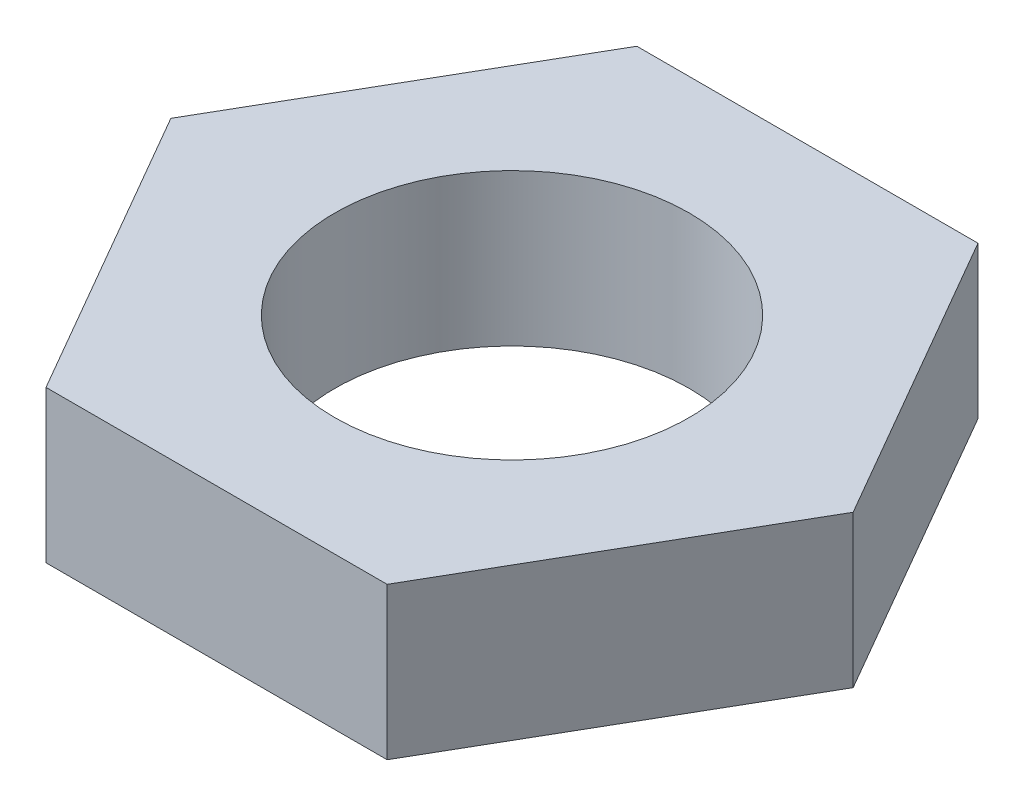
ISO-10303-21;
HEADER;
FILE_DESCRIPTION(('STEP AP214'),'2;1');
FILE_NAME('part.step','',(''),(''),'','','');
FILE_SCHEMA(('AUTOMOTIVE_DESIGN { 1 0 10303 214 1 1 1 1 }'));
ENDSEC;
DATA;
#1=APPLICATION_CONTEXT('core data for automotive mechanical design processes');
#2=APPLICATION_PROTOCOL_DEFINITION('international standard','automotive_design',2000,#1);
#3=PRODUCT_CONTEXT('',#1,'mechanical');
#4=PRODUCT('Part','Part','',(#3));
#5=PRODUCT_RELATED_PRODUCT_CATEGORY('part','',(#4));
#6=PRODUCT_DEFINITION_FORMATION('','',#4);
#7=PRODUCT_DEFINITION_CONTEXT('part definition',#1,'design');
#8=PRODUCT_DEFINITION('design','',#6,#7);
#9=PRODUCT_DEFINITION_SHAPE('','',#8);
#10=(LENGTH_UNIT() NAMED_UNIT(*) SI_UNIT(.MILLI.,.METRE.));
#11=(NAMED_UNIT(*) PLANE_ANGLE_UNIT() SI_UNIT($,.RADIAN.));
#12=(NAMED_UNIT(*) SI_UNIT($,.STERADIAN.) SOLID_ANGLE_UNIT());
#13=UNCERTAINTY_MEASURE_WITH_UNIT(LENGTH_MEASURE(1.E-05),#10,'distance_accuracy_value','');
#14=(GEOMETRIC_REPRESENTATION_CONTEXT(3) GLOBAL_UNCERTAINTY_ASSIGNED_CONTEXT((#13)) GLOBAL_UNIT_ASSIGNED_CONTEXT((#10,
#11,#12)) REPRESENTATION_CONTEXT('',''));
#15=CARTESIAN_POINT('',(0.,0.,0.));
#16=DIRECTION('',(0.,0.,1.));
#17=DIRECTION('',(1.,0.,0.));
#18=AXIS2_PLACEMENT_3D('',#15,#16,#17);
#19=CARTESIAN_POINT('',(0.,1.8,0.));
#20=DIRECTION('',(0.,1.,0.));
#21=DIRECTION('',(0.,0.,1.));
#22=AXIS2_PLACEMENT_3D('',#19,#20,#21);
#23=PLANE('',#22);
#24=DIRECTION('',(0.499999999999995,0.,-0.866025403784441));
#25=VECTOR('',#24,1.);
#26=CARTESIAN_POINT('',(2.02072594216373,1.8,3.49999999999998));
#27=LINE('',#26,#25);
#28=CARTESIAN_POINT('',(2.02072594216373,1.8,3.49999999999998));
#29=VERTEX_POINT('',#28);
#30=CARTESIAN_POINT('',(4.04145188432738,1.8,0.));
#31=VERTEX_POINT('',#30);
#32=EDGE_CURVE('E152',#29,#31,#27,.T.);
#33=ORIENTED_EDGE('',*,*,#32,.T.);
#34=DIRECTION('',(-0.500000000000001,0.,-0.866025403784438));
#35=VECTOR('',#34,1.);
#36=CARTESIAN_POINT('',(4.04145188432738,1.8,0.));
#37=LINE('',#36,#35);
#38=CARTESIAN_POINT('',(2.02072594216368,1.8,-3.50000000000001));
#39=VERTEX_POINT('',#38);
#40=EDGE_CURVE('E100',#31,#39,#37,.T.);
#41=ORIENTED_EDGE('',*,*,#40,.T.);
#42=DIRECTION('',(-1.,0.,0.));
#43=VECTOR('',#42,1.);
#44=CARTESIAN_POINT('',(2.02072594216368,1.8,-3.50000000000001));
#45=LINE('',#44,#43);
#46=CARTESIAN_POINT('',(-2.02072594216371,1.8,-3.49999999999999));
#47=VERTEX_POINT('',#46);
#48=EDGE_CURVE('E113',#39,#47,#45,.T.);
#49=ORIENTED_EDGE('',*,*,#48,.T.);
#50=DIRECTION('',(-0.499999999999995,0.,0.866025403784442));
#51=VECTOR('',#50,1.);
#52=CARTESIAN_POINT('',(-2.02072594216371,1.8,-3.49999999999999));
#53=LINE('',#52,#51);
#54=CARTESIAN_POINT('',(-4.04145188432738,1.8,0.));
#55=VERTEX_POINT('',#54);
#56=EDGE_CURVE('E107',#47,#55,#53,.T.);
#57=ORIENTED_EDGE('',*,*,#56,.T.);
#58=DIRECTION('',(0.500000000000007,0.,0.866025403784435));
#59=VECTOR('',#58,1.);
#60=CARTESIAN_POINT('',(-4.04145188432738,1.8,0.));
#61=LINE('',#60,#59);
#62=CARTESIAN_POINT('',(-2.02072594216366,1.8,3.50000000000002));
#63=VERTEX_POINT('',#62);
#64=EDGE_CURVE('E111',#55,#63,#61,.T.);
#65=ORIENTED_EDGE('',*,*,#64,.T.);
#66=DIRECTION('',(1.,0.,0.));
#67=VECTOR('',#66,1.);
#68=CARTESIAN_POINT('',(-2.02072594216366,1.8,3.50000000000002));
#69=LINE('',#68,#67);
#70=EDGE_CURVE('E63',#63,#29,#69,.T.);
#71=ORIENTED_EDGE('',*,*,#70,.T.);
#72=EDGE_LOOP('',(#33,#41,#49,#57,#65,#71));
#73=FACE_BOUND('',#72,.T.);
#74=CARTESIAN_POINT('',(0.,1.8,0.));
#75=DIRECTION('',(0.,1.,0.));
#76=DIRECTION('',(0.,0.,1.));
#77=AXIS2_PLACEMENT_3D('',#74,#75,#76);
#78=CIRCLE('',#77,2.1);
#79=CARTESIAN_POINT('',(0.,1.8,2.1));
#80=VERTEX_POINT('',#79);
#81=EDGE_CURVE('E140',#80,#80,#78,.T.);
#82=ORIENTED_EDGE('',*,*,#81,.F.);
#83=EDGE_LOOP('',(#82));
#84=FACE_BOUND('',#83,.T.);
#85=ADVANCED_FACE('F45',(#73,#84),#23,.T.);
#86=CARTESIAN_POINT('',(0.,0.,0.));
#87=DIRECTION('',(0.,1.,0.));
#88=DIRECTION('',(0.,0.,1.));
#89=AXIS2_PLACEMENT_3D('',#86,#87,#88);
#90=PLANE('',#89);
#91=DIRECTION('',(0.499999999999995,0.,-0.866025403784441));
#92=VECTOR('',#91,1.);
#93=CARTESIAN_POINT('',(2.02072594216373,0.,3.49999999999998));
#94=LINE('',#93,#92);
#95=CARTESIAN_POINT('',(2.02072594216373,0.,3.49999999999998));
#96=VERTEX_POINT('',#95);
#97=CARTESIAN_POINT('',(4.04145188432738,0.,0.));
#98=VERTEX_POINT('',#97);
#99=EDGE_CURVE('E135',#96,#98,#94,.T.);
#100=ORIENTED_EDGE('',*,*,#99,.F.);
#101=DIRECTION('',(1.,0.,0.));
#102=VECTOR('',#101,1.);
#103=CARTESIAN_POINT('',(-2.02072594216366,0.,3.50000000000002));
#104=LINE('',#103,#102);
#105=CARTESIAN_POINT('',(-2.02072594216366,0.,3.50000000000002));
#106=VERTEX_POINT('',#105);
#107=EDGE_CURVE('E92',#106,#96,#104,.T.);
#108=ORIENTED_EDGE('',*,*,#107,.F.);
#109=DIRECTION('',(0.500000000000007,0.,0.866025403784435));
#110=VECTOR('',#109,1.);
#111=CARTESIAN_POINT('',(-4.04145188432738,0.,0.));
#112=LINE('',#111,#110);
#113=CARTESIAN_POINT('',(-4.04145188432738,0.,0.));
#114=VERTEX_POINT('',#113);
#115=EDGE_CURVE('E86',#114,#106,#112,.T.);
#116=ORIENTED_EDGE('',*,*,#115,.F.);
#117=DIRECTION('',(-0.499999999999995,0.,0.866025403784442));
#118=VECTOR('',#117,1.);
#119=CARTESIAN_POINT('',(-2.02072594216371,0.,-3.49999999999999));
#120=LINE('',#119,#118);
#121=CARTESIAN_POINT('',(-2.02072594216371,0.,-3.49999999999999));
#122=VERTEX_POINT('',#121);
#123=EDGE_CURVE('E122',#122,#114,#120,.T.);
#124=ORIENTED_EDGE('',*,*,#123,.F.);
#125=DIRECTION('',(-1.,0.,0.));
#126=VECTOR('',#125,1.);
#127=CARTESIAN_POINT('',(2.02072594216368,0.,-3.50000000000001));
#128=LINE('',#127,#126);
#129=CARTESIAN_POINT('',(2.02072594216368,0.,-3.50000000000001));
#130=VERTEX_POINT('',#129);
#131=EDGE_CURVE('E143',#130,#122,#128,.T.);
#132=ORIENTED_EDGE('',*,*,#131,.F.);
#133=DIRECTION('',(-0.500000000000001,0.,-0.866025403784438));
#134=VECTOR('',#133,1.);
#135=CARTESIAN_POINT('',(4.04145188432738,0.,0.));
#136=LINE('',#135,#134);
#137=EDGE_CURVE('E139',#98,#130,#136,.T.);
#138=ORIENTED_EDGE('',*,*,#137,.F.);
#139=EDGE_LOOP('',(#100,#108,#116,#124,#132,#138));
#140=FACE_BOUND('',#139,.T.);
#141=CARTESIAN_POINT('',(0.,0.,0.));
#142=DIRECTION('',(0.,1.,0.));
#143=DIRECTION('',(0.,0.,1.));
#144=AXIS2_PLACEMENT_3D('',#141,#142,#143);
#145=CIRCLE('',#144,2.1);
#146=CARTESIAN_POINT('',(0.,0.,2.1));
#147=VERTEX_POINT('',#146);
#148=EDGE_CURVE('E249',#147,#147,#145,.T.);
#149=ORIENTED_EDGE('',*,*,#148,.T.);
#150=EDGE_LOOP('',(#149));
#151=FACE_BOUND('',#150,.T.);
#152=ADVANCED_FACE('F165',(#140,#151),#90,.F.);
#153=CARTESIAN_POINT('',(2.02072594216373,1.8,3.49999999999998));
#154=DIRECTION('',(-0.866025403784441,0.,-0.499999999999995));
#155=DIRECTION('',(-0.499999999999995,0.,0.866025403784442));
#156=AXIS2_PLACEMENT_3D('',#153,#154,#155);
#157=PLANE('',#156);
#158=ORIENTED_EDGE('',*,*,#99,.T.);
#159=DIRECTION('',(0.,-1.,0.));
#160=VECTOR('',#159,1.);
#161=CARTESIAN_POINT('',(4.04145188432738,1.8,0.));
#162=LINE('',#161,#160);
#163=EDGE_CURVE('E11',#31,#98,#162,.T.);
#164=ORIENTED_EDGE('',*,*,#163,.F.);
#165=ORIENTED_EDGE('',*,*,#32,.F.);
#166=DIRECTION('',(0.,-1.,0.));
#167=VECTOR('',#166,1.);
#168=CARTESIAN_POINT('',(2.02072594216373,1.8,3.49999999999998));
#169=LINE('',#168,#167);
#170=EDGE_CURVE('E131',#29,#96,#169,.T.);
#171=ORIENTED_EDGE('',*,*,#170,.T.);
#172=EDGE_LOOP('',(#158,#164,#165,#171));
#173=FACE_BOUND('',#172,.T.);
#174=ADVANCED_FACE('F47',(#173),#157,.F.);
#175=CARTESIAN_POINT('',(4.04145188432738,1.8,0.));
#176=DIRECTION('',(-0.866025403784438,0.,0.500000000000001));
#177=DIRECTION('',(0.500000000000001,0.,0.866025403784438));
#178=AXIS2_PLACEMENT_3D('',#175,#176,#177);
#179=PLANE('',#178);
#180=ORIENTED_EDGE('',*,*,#137,.T.);
#181=DIRECTION('',(0.,-1.,0.));
#182=VECTOR('',#181,1.);
#183=CARTESIAN_POINT('',(2.02072594216368,1.8,-3.50000000000001));
#184=LINE('',#183,#182);
#185=EDGE_CURVE('E55',#39,#130,#184,.T.);
#186=ORIENTED_EDGE('',*,*,#185,.F.);
#187=ORIENTED_EDGE('',*,*,#40,.F.);
#188=ORIENTED_EDGE('',*,*,#163,.T.);
#189=EDGE_LOOP('',(#180,#186,#187,#188));
#190=FACE_BOUND('',#189,.T.);
#191=ADVANCED_FACE('F190',(#190),#179,.F.);
#192=CARTESIAN_POINT('',(2.02072594216368,1.8,-3.50000000000001));
#193=DIRECTION('',(0.,0.,1.));
#194=DIRECTION('',(1.,0.,0.));
#195=AXIS2_PLACEMENT_3D('',#192,#193,#194);
#196=PLANE('',#195);
#197=ORIENTED_EDGE('',*,*,#131,.T.);
#198=DIRECTION('',(0.,-1.,0.));
#199=VECTOR('',#198,1.);
#200=CARTESIAN_POINT('',(-2.02072594216371,1.8,-3.49999999999999));
#201=LINE('',#200,#199);
#202=EDGE_CURVE('E124',#47,#122,#201,.T.);
#203=ORIENTED_EDGE('',*,*,#202,.F.);
#204=ORIENTED_EDGE('',*,*,#48,.F.);
#205=ORIENTED_EDGE('',*,*,#185,.T.);
#206=EDGE_LOOP('',(#197,#203,#204,#205));
#207=FACE_BOUND('',#206,.T.);
#208=ADVANCED_FACE('F162',(#207),#196,.F.);
#209=CARTESIAN_POINT('',(-2.02072594216371,1.8,-3.49999999999999));
#210=DIRECTION('',(0.866025403784442,0.,0.499999999999995));
#211=DIRECTION('',(0.499999999999995,0.,-0.866025403784442));
#212=AXIS2_PLACEMENT_3D('',#209,#210,#211);
#213=PLANE('',#212);
#214=ORIENTED_EDGE('',*,*,#123,.T.);
#215=DIRECTION('',(0.,-1.,0.));
#216=VECTOR('',#215,1.);
#217=CARTESIAN_POINT('',(-4.04145188432738,1.8,0.));
#218=LINE('',#217,#216);
#219=EDGE_CURVE('E119',#55,#114,#218,.T.);
#220=ORIENTED_EDGE('',*,*,#219,.F.);
#221=ORIENTED_EDGE('',*,*,#56,.F.);
#222=ORIENTED_EDGE('',*,*,#202,.T.);
#223=EDGE_LOOP('',(#214,#220,#221,#222));
#224=FACE_BOUND('',#223,.T.);
#225=ADVANCED_FACE('F120',(#224),#213,.F.);
#226=CARTESIAN_POINT('',(-4.04145188432738,1.8,0.));
#227=DIRECTION('',(0.866025403784435,0.,-0.500000000000007));
#228=DIRECTION('',(-0.500000000000007,0.,-0.866025403784435));
#229=AXIS2_PLACEMENT_3D('',#226,#227,#228);
#230=PLANE('',#229);
#231=ORIENTED_EDGE('',*,*,#115,.T.);
#232=DIRECTION('',(0.,-1.,0.));
#233=VECTOR('',#232,1.);
#234=CARTESIAN_POINT('',(-2.02072594216366,1.8,3.50000000000002));
#235=LINE('',#234,#233);
#236=EDGE_CURVE('E125',#63,#106,#235,.T.);
#237=ORIENTED_EDGE('',*,*,#236,.F.);
#238=ORIENTED_EDGE('',*,*,#64,.F.);
#239=ORIENTED_EDGE('',*,*,#219,.T.);
#240=EDGE_LOOP('',(#231,#237,#238,#239));
#241=FACE_BOUND('',#240,.T.);
#242=ADVANCED_FACE('F127',(#241),#230,.F.);
#243=CARTESIAN_POINT('',(-2.02072594216366,1.8,3.50000000000002));
#244=DIRECTION('',(0.,0.,-1.));
#245=DIRECTION('',(-1.,0.,0.));
#246=AXIS2_PLACEMENT_3D('',#243,#244,#245);
#247=PLANE('',#246);
#248=ORIENTED_EDGE('',*,*,#107,.T.);
#249=ORIENTED_EDGE('',*,*,#170,.F.);
#250=ORIENTED_EDGE('',*,*,#70,.F.);
#251=ORIENTED_EDGE('',*,*,#236,.T.);
#252=EDGE_LOOP('',(#248,#249,#250,#251));
#253=FACE_BOUND('',#252,.T.);
#254=ADVANCED_FACE('F170',(#253),#247,.F.);
#255=CARTESIAN_POINT('',(0.,1.8,0.));
#256=DIRECTION('',(0.,-1.,0.));
#257=DIRECTION('',(0.,0.,-1.));
#258=AXIS2_PLACEMENT_3D('',#255,#256,#257);
#259=CYLINDRICAL_SURFACE('',#258,2.1);
#260=ORIENTED_EDGE('',*,*,#81,.T.);
#261=EDGE_LOOP('',(#260));
#262=FACE_BOUND('',#261,.T.);
#263=ORIENTED_EDGE('',*,*,#148,.F.);
#264=EDGE_LOOP('',(#263));
#265=FACE_BOUND('',#264,.T.);
#266=ADVANCED_FACE('F172',(#262,#265),#259,.F.);
#267=CLOSED_SHELL('',(#85,#152,#174,#191,#208,#225,#242,#254,#266));
#268=MANIFOLD_SOLID_BREP('B2',#267);
#269=ADVANCED_BREP_SHAPE_REPRESENTATION('',(#18,#268),#14);
#270=SHAPE_DEFINITION_REPRESENTATION(#9,#269);
ENDSEC;
END-ISO-10303-21;
